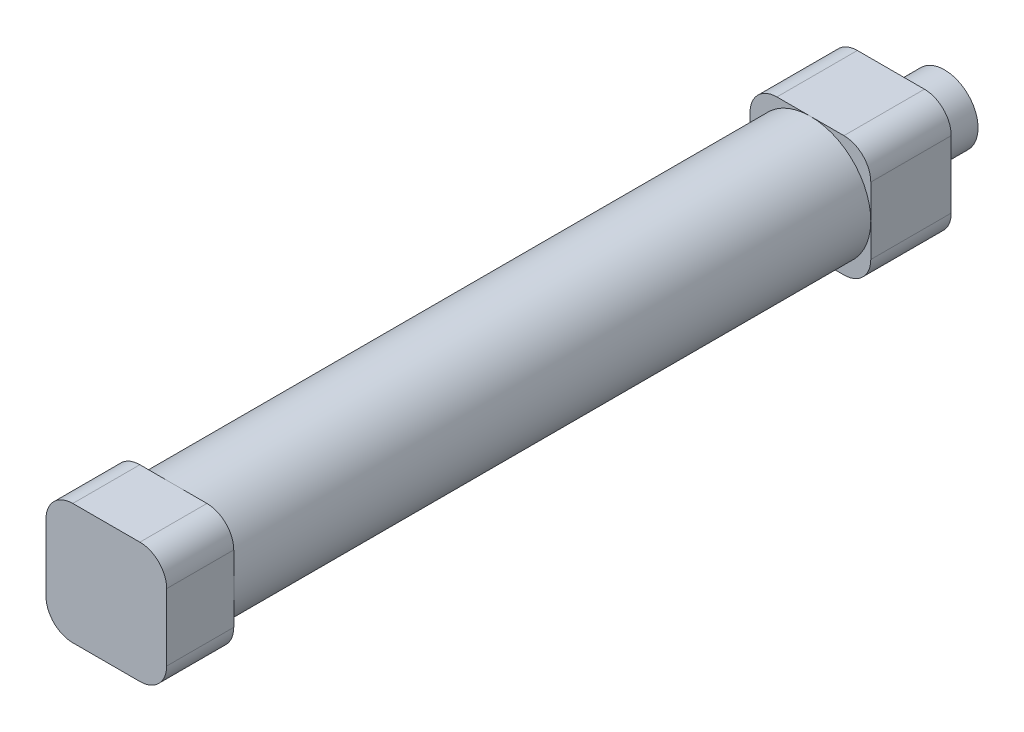
ISO-10303-21;
HEADER;
FILE_DESCRIPTION(('STEP AP214'),'2;1');
FILE_NAME('part.step','',(''),(''),'','','');
FILE_SCHEMA(('AUTOMOTIVE_DESIGN { 1 0 10303 214 1 1 1 1 }'));
ENDSEC;
DATA;
#1=APPLICATION_CONTEXT('core data for automotive mechanical design processes');
#2=APPLICATION_PROTOCOL_DEFINITION('international standard','automotive_design',2000,#1);
#3=PRODUCT_CONTEXT('',#1,'mechanical');
#4=PRODUCT('Part','Part','',(#3));
#5=PRODUCT_RELATED_PRODUCT_CATEGORY('part','',(#4));
#6=PRODUCT_DEFINITION_FORMATION('','',#4);
#7=PRODUCT_DEFINITION_CONTEXT('part definition',#1,'design');
#8=PRODUCT_DEFINITION('design','',#6,#7);
#9=PRODUCT_DEFINITION_SHAPE('','',#8);
#10=(LENGTH_UNIT() NAMED_UNIT(*) SI_UNIT(.MILLI.,.METRE.));
#11=(NAMED_UNIT(*) PLANE_ANGLE_UNIT() SI_UNIT($,.RADIAN.));
#12=(NAMED_UNIT(*) SI_UNIT($,.STERADIAN.) SOLID_ANGLE_UNIT());
#13=UNCERTAINTY_MEASURE_WITH_UNIT(LENGTH_MEASURE(1.E-05),#10,'distance_accuracy_value','');
#14=(GEOMETRIC_REPRESENTATION_CONTEXT(3) GLOBAL_UNCERTAINTY_ASSIGNED_CONTEXT((#13)) GLOBAL_UNIT_ASSIGNED_CONTEXT((#10,
#11,#12)) REPRESENTATION_CONTEXT('',''));
#15=CARTESIAN_POINT('',(0.,0.,0.));
#16=DIRECTION('',(0.,0.,1.));
#17=DIRECTION('',(1.,0.,0.));
#18=AXIS2_PLACEMENT_3D('',#15,#16,#17);
#19=CARTESIAN_POINT('',(4.99999999999999,-5.,0.));
#20=DIRECTION('',(0.,0.,-1.));
#21=DIRECTION('',(-1.,0.,0.));
#22=AXIS2_PLACEMENT_3D('',#19,#20,#21);
#23=PLANE('',#22);
#24=CARTESIAN_POINT('',(0.,0.,0.));
#25=DIRECTION('',(0.,0.,-1.));
#26=DIRECTION('',(-1.,0.,0.));
#27=AXIS2_PLACEMENT_3D('',#24,#25,#26);
#28=CIRCLE('',#27,2.5);
#29=CARTESIAN_POINT('',(-2.5,0.,0.));
#30=VERTEX_POINT('',#29);
#31=EDGE_CURVE('E40',#30,#30,#28,.T.);
#32=ORIENTED_EDGE('',*,*,#31,.T.);
#33=EDGE_LOOP('',(#32));
#34=FACE_BOUND('',#33,.T.);
#35=CARTESIAN_POINT('',(0.,0.,0.));
#36=DIRECTION('',(0.,0.,1.));
#37=DIRECTION('',(1.,0.,0.));
#38=AXIS2_PLACEMENT_3D('',#35,#36,#37);
#39=CIRCLE('',#38,8.);
#40=CARTESIAN_POINT('',(8.,0.,0.));
#41=VERTEX_POINT('',#40);
#42=EDGE_CURVE('E276',#41,#41,#39,.T.);
#43=ORIENTED_EDGE('',*,*,#42,.T.);
#44=EDGE_LOOP('',(#43));
#45=FACE_BOUND('',#44,.T.);
#46=ADVANCED_FACE('F36',(#34,#45),#23,.F.);
#47=CARTESIAN_POINT('',(-5.,5.,95.));
#48=DIRECTION('',(0.,0.,1.));
#49=DIRECTION('',(1.,0.,0.));
#50=AXIS2_PLACEMENT_3D('',#47,#48,#49);
#51=PLANE('',#50);
#52=CARTESIAN_POINT('',(0.,0.,95.));
#53=DIRECTION('',(0.,0.,1.));
#54=DIRECTION('',(1.,0.,0.));
#55=AXIS2_PLACEMENT_3D('',#52,#53,#54);
#56=CIRCLE('',#55,8.);
#57=CARTESIAN_POINT('',(8.,0.,95.));
#58=VERTEX_POINT('',#57);
#59=EDGE_CURVE('E273',#58,#58,#56,.T.);
#60=ORIENTED_EDGE('',*,*,#59,.F.);
#61=EDGE_LOOP('',(#60));
#62=FACE_BOUND('',#61,.T.);
#63=ADVANCED_FACE('F366',(#62),#51,.F.);
#64=CARTESIAN_POINT('',(0.,0.,95.));
#65=DIRECTION('',(0.,0.,-1.));
#66=DIRECTION('',(-1.,0.,0.));
#67=AXIS2_PLACEMENT_3D('',#64,#65,#66);
#68=CYLINDRICAL_SURFACE('',#67,8.);
#69=ORIENTED_EDGE('',*,*,#59,.T.);
#70=EDGE_LOOP('',(#69));
#71=FACE_BOUND('',#70,.T.);
#72=ORIENTED_EDGE('',*,*,#42,.F.);
#73=EDGE_LOOP('',(#72));
#74=FACE_BOUND('',#73,.T.);
#75=ADVANCED_FACE('F373',(#71,#74),#68,.F.);
#76=CARTESIAN_POINT('',(0.,0.,18.));
#77=DIRECTION('',(0.,0.,-1.));
#78=DIRECTION('',(-1.,0.,0.));
#79=AXIS2_PLACEMENT_3D('',#76,#77,#78);
#80=CYLINDRICAL_SURFACE('',#79,2.5);
#81=CARTESIAN_POINT('',(0.,0.,-20.));
#82=DIRECTION('',(0.,0.,-1.));
#83=DIRECTION('',(-1.,0.,0.));
#84=AXIS2_PLACEMENT_3D('',#81,#82,#83);
#85=CIRCLE('',#84,2.5);
#86=CARTESIAN_POINT('',(-2.5,0.,-20.));
#87=VERTEX_POINT('',#86);
#88=EDGE_CURVE('E564',#87,#87,#85,.T.);
#89=ORIENTED_EDGE('',*,*,#88,.T.);
#90=EDGE_LOOP('',(#89));
#91=FACE_BOUND('',#90,.T.);
#92=ORIENTED_EDGE('',*,*,#31,.F.);
#93=EDGE_LOOP('',(#92));
#94=FACE_BOUND('',#93,.T.);
#95=ADVANCED_FACE('F455',(#91,#94),#80,.F.);
#96=CARTESIAN_POINT('',(4.99999999999999,-5.,-12.));
#97=DIRECTION('',(0.,0.,-1.));
#98=DIRECTION('',(-1.,0.,0.));
#99=AXIS2_PLACEMENT_3D('',#96,#97,#98);
#100=PLANE('',#99);
#101=CARTESIAN_POINT('',(4.99999999999999,-5.,-12.));
#102=DIRECTION('',(0.,0.,-1.));
#103=DIRECTION('',(-1.,0.,0.));
#104=AXIS2_PLACEMENT_3D('',#101,#102,#103);
#105=CIRCLE('',#104,4.);
#106=CARTESIAN_POINT('',(8.99999999999999,-5.,-12.));
#107=VERTEX_POINT('',#106);
#108=CARTESIAN_POINT('',(4.99999999999999,-9.,-12.));
#109=VERTEX_POINT('',#108);
#110=EDGE_CURVE('E188',#107,#109,#105,.T.);
#111=ORIENTED_EDGE('',*,*,#110,.T.);
#112=DIRECTION('',(-1.,0.,0.));
#113=VECTOR('',#112,1.);
#114=CARTESIAN_POINT('',(4.99999999999999,-9.,-12.));
#115=LINE('',#114,#113);
#116=CARTESIAN_POINT('',(-5.00000000000001,-9.,-12.));
#117=VERTEX_POINT('',#116);
#118=EDGE_CURVE('E176',#109,#117,#115,.T.);
#119=ORIENTED_EDGE('',*,*,#118,.T.);
#120=CARTESIAN_POINT('',(-5.00000000000001,-5.,-12.));
#121=DIRECTION('',(0.,0.,-1.));
#122=DIRECTION('',(-1.,0.,0.));
#123=AXIS2_PLACEMENT_3D('',#120,#121,#122);
#124=CIRCLE('',#123,4.);
#125=CARTESIAN_POINT('',(-9.00000000000001,-5.,-12.));
#126=VERTEX_POINT('',#125);
#127=EDGE_CURVE('E187',#117,#126,#124,.T.);
#128=ORIENTED_EDGE('',*,*,#127,.T.);
#129=DIRECTION('',(0.,1.,0.));
#130=VECTOR('',#129,1.);
#131=CARTESIAN_POINT('',(-9.00000000000001,-5.,-12.));
#132=LINE('',#131,#130);
#133=CARTESIAN_POINT('',(-9.00000000000001,5.,-12.));
#134=VERTEX_POINT('',#133);
#135=EDGE_CURVE('E342',#126,#134,#132,.T.);
#136=ORIENTED_EDGE('',*,*,#135,.T.);
#137=CARTESIAN_POINT('',(-5.00000000000001,5.,-12.));
#138=DIRECTION('',(0.,0.,-1.));
#139=DIRECTION('',(-1.,0.,0.));
#140=AXIS2_PLACEMENT_3D('',#137,#138,#139);
#141=CIRCLE('',#140,4.);
#142=CARTESIAN_POINT('',(-5.00000000000001,9.,-12.));
#143=VERTEX_POINT('',#142);
#144=EDGE_CURVE('E341',#134,#143,#141,.T.);
#145=ORIENTED_EDGE('',*,*,#144,.T.);
#146=DIRECTION('',(1.,0.,0.));
#147=VECTOR('',#146,1.);
#148=CARTESIAN_POINT('',(4.99999999999999,9.,-12.));
#149=LINE('',#148,#147);
#150=CARTESIAN_POINT('',(4.99999999999999,9.,-12.));
#151=VERTEX_POINT('',#150);
#152=EDGE_CURVE('E344',#143,#151,#149,.T.);
#153=ORIENTED_EDGE('',*,*,#152,.T.);
#154=CARTESIAN_POINT('',(4.99999999999999,5.,-12.));
#155=DIRECTION('',(0.,0.,-1.));
#156=DIRECTION('',(-1.,0.,0.));
#157=AXIS2_PLACEMENT_3D('',#154,#155,#156);
#158=CIRCLE('',#157,4.);
#159=CARTESIAN_POINT('',(8.99999999999999,5.,-12.));
#160=VERTEX_POINT('',#159);
#161=EDGE_CURVE('E349',#151,#160,#158,.T.);
#162=ORIENTED_EDGE('',*,*,#161,.T.);
#163=DIRECTION('',(0.,-1.,0.));
#164=VECTOR('',#163,1.);
#165=CARTESIAN_POINT('',(8.99999999999999,-5.,-12.));
#166=LINE('',#165,#164);
#167=EDGE_CURVE('E194',#160,#107,#166,.T.);
#168=ORIENTED_EDGE('',*,*,#167,.T.);
#169=EDGE_LOOP('',(#111,#119,#128,#136,#145,#153,#162,#168));
#170=FACE_BOUND('',#169,.T.);
#171=CARTESIAN_POINT('',(0.,0.,-12.));
#172=DIRECTION('',(0.,0.,-1.));
#173=DIRECTION('',(-1.,0.,0.));
#174=AXIS2_PLACEMENT_3D('',#171,#172,#173);
#175=CIRCLE('',#174,5.);
#176=CARTESIAN_POINT('',(-5.,0.,-12.));
#177=VERTEX_POINT('',#176);
#178=EDGE_CURVE('E570',#177,#177,#175,.T.);
#179=ORIENTED_EDGE('',*,*,#178,.F.);
#180=EDGE_LOOP('',(#179));
#181=FACE_BOUND('',#180,.T.);
#182=ADVANCED_FACE('F191',(#170,#181),#100,.T.);
#183=CARTESIAN_POINT('',(0.,0.,95.));
#184=DIRECTION('',(0.,0.,-1.));
#185=DIRECTION('',(-1.,0.,0.));
#186=AXIS2_PLACEMENT_3D('',#183,#184,#185);
#187=CYLINDRICAL_SURFACE('',#186,9.);
#188=CARTESIAN_POINT('',(0.,0.,95.));
#189=DIRECTION('',(0.,0.,1.));
#190=DIRECTION('',(1.,0.,0.));
#191=AXIS2_PLACEMENT_3D('',#188,#189,#190);
#192=CIRCLE('',#191,9.);
#193=CARTESIAN_POINT('',(9.,0.,95.));
#194=VERTEX_POINT('',#193);
#195=CARTESIAN_POINT('',(0.,9.,95.));
#196=VERTEX_POINT('',#195);
#197=EDGE_CURVE('E12',#194,#196,#192,.T.);
#198=ORIENTED_EDGE('',*,*,#197,.F.);
#199=CARTESIAN_POINT('',(0.,-9.,95.));
#200=VERTEX_POINT('',#199);
#201=EDGE_CURVE('E47',#200,#194,#192,.T.);
#202=ORIENTED_EDGE('',*,*,#201,.F.);
#203=CARTESIAN_POINT('',(-9.,0.,95.));
#204=VERTEX_POINT('',#203);
#205=EDGE_CURVE('E286',#204,#200,#192,.T.);
#206=ORIENTED_EDGE('',*,*,#205,.F.);
#207=EDGE_CURVE('E45',#196,#204,#192,.T.);
#208=ORIENTED_EDGE('',*,*,#207,.F.);
#209=EDGE_LOOP('',(#198,#202,#206,#208));
#210=FACE_BOUND('',#209,.T.);
#211=CARTESIAN_POINT('',(0.,0.,0.));
#212=DIRECTION('',(0.,0.,1.));
#213=DIRECTION('',(1.,0.,0.));
#214=AXIS2_PLACEMENT_3D('',#211,#212,#213);
#215=CIRCLE('',#214,9.);
#216=CARTESIAN_POINT('',(8.99999999999999,0.,0.));
#217=VERTEX_POINT('',#216);
#218=CARTESIAN_POINT('',(0.,9.,0.));
#219=VERTEX_POINT('',#218);
#220=EDGE_CURVE('E279',#217,#219,#215,.T.);
#221=ORIENTED_EDGE('',*,*,#220,.T.);
#222=CARTESIAN_POINT('',(-9.00000000000001,0.,0.));
#223=VERTEX_POINT('',#222);
#224=EDGE_CURVE('E281',#219,#223,#215,.T.);
#225=ORIENTED_EDGE('',*,*,#224,.T.);
#226=CARTESIAN_POINT('',(0.,-9.,0.));
#227=VERTEX_POINT('',#226);
#228=EDGE_CURVE('E287',#223,#227,#215,.T.);
#229=ORIENTED_EDGE('',*,*,#228,.T.);
#230=EDGE_CURVE('E278',#227,#217,#215,.T.);
#231=ORIENTED_EDGE('',*,*,#230,.T.);
#232=EDGE_LOOP('',(#221,#225,#229,#231));
#233=FACE_BOUND('',#232,.T.);
#234=ADVANCED_FACE('F38',(#210,#233),#187,.T.);
#235=DIRECTION('',(0.,1.,0.));
#236=VECTOR('',#235,1.);
#237=CARTESIAN_POINT('',(9.,-5.,95.));
#238=LINE('',#237,#236);
#239=CARTESIAN_POINT('',(9.,5.,95.));
#240=VERTEX_POINT('',#239);
#241=EDGE_CURVE('E241',#194,#240,#238,.T.);
#242=ORIENTED_EDGE('',*,*,#241,.F.);
#243=ORIENTED_EDGE('',*,*,#197,.T.);
#244=DIRECTION('',(-1.,0.,0.));
#245=VECTOR('',#244,1.);
#246=CARTESIAN_POINT('',(-5.,9.,95.));
#247=LINE('',#246,#245);
#248=CARTESIAN_POINT('',(5.,9.,95.));
#249=VERTEX_POINT('',#248);
#250=EDGE_CURVE('E215',#249,#196,#247,.T.);
#251=ORIENTED_EDGE('',*,*,#250,.F.);
#252=CARTESIAN_POINT('',(5.,5.,95.));
#253=DIRECTION('',(0.,0.,1.));
#254=DIRECTION('',(1.,0.,0.));
#255=AXIS2_PLACEMENT_3D('',#252,#253,#254);
#256=CIRCLE('',#255,4.);
#257=EDGE_CURVE('E245',#240,#249,#256,.T.);
#258=ORIENTED_EDGE('',*,*,#257,.F.);
#259=EDGE_LOOP('',(#242,#243,#251,#258));
#260=FACE_BOUND('',#259,.T.);
#261=ADVANCED_FACE('F376',(#260),#51,.F.);
#262=CARTESIAN_POINT('',(-5.,9.,95.));
#263=VERTEX_POINT('',#262);
#264=EDGE_CURVE('E247',#196,#263,#247,.T.);
#265=ORIENTED_EDGE('',*,*,#264,.F.);
#266=ORIENTED_EDGE('',*,*,#207,.T.);
#267=DIRECTION('',(0.,-1.,0.));
#268=VECTOR('',#267,1.);
#269=CARTESIAN_POINT('',(-9.,-5.,95.));
#270=LINE('',#269,#268);
#271=CARTESIAN_POINT('',(-9.,5.,95.));
#272=VERTEX_POINT('',#271);
#273=EDGE_CURVE('E230',#272,#204,#270,.T.);
#274=ORIENTED_EDGE('',*,*,#273,.F.);
#275=CARTESIAN_POINT('',(-5.,5.,95.));
#276=DIRECTION('',(0.,0.,1.));
#277=DIRECTION('',(1.,0.,0.));
#278=AXIS2_PLACEMENT_3D('',#275,#276,#277);
#279=CIRCLE('',#278,4.);
#280=EDGE_CURVE('E202',#263,#272,#279,.T.);
#281=ORIENTED_EDGE('',*,*,#280,.F.);
#282=EDGE_LOOP('',(#265,#266,#274,#281));
#283=FACE_BOUND('',#282,.T.);
#284=ADVANCED_FACE('F592',(#283),#51,.F.);
#285=CARTESIAN_POINT('',(-9.,-5.,95.));
#286=VERTEX_POINT('',#285);
#287=EDGE_CURVE('E205',#204,#286,#270,.T.);
#288=ORIENTED_EDGE('',*,*,#287,.F.);
#289=ORIENTED_EDGE('',*,*,#205,.T.);
#290=DIRECTION('',(1.,0.,0.));
#291=VECTOR('',#290,1.);
#292=CARTESIAN_POINT('',(-5.,-9.,95.));
#293=LINE('',#292,#291);
#294=CARTESIAN_POINT('',(-5.,-9.,95.));
#295=VERTEX_POINT('',#294);
#296=EDGE_CURVE('E236',#295,#200,#293,.T.);
#297=ORIENTED_EDGE('',*,*,#296,.F.);
#298=CARTESIAN_POINT('',(-5.,-5.,95.));
#299=DIRECTION('',(0.,0.,1.));
#300=DIRECTION('',(1.,0.,0.));
#301=AXIS2_PLACEMENT_3D('',#298,#299,#300);
#302=CIRCLE('',#301,4.);
#303=EDGE_CURVE('E233',#286,#295,#302,.T.);
#304=ORIENTED_EDGE('',*,*,#303,.F.);
#305=EDGE_LOOP('',(#288,#289,#297,#304));
#306=FACE_BOUND('',#305,.T.);
#307=ADVANCED_FACE('F595',(#306),#51,.F.);
#308=CARTESIAN_POINT('',(5.,-9.,95.));
#309=VERTEX_POINT('',#308);
#310=EDGE_CURVE('E235',#200,#309,#293,.T.);
#311=ORIENTED_EDGE('',*,*,#310,.F.);
#312=ORIENTED_EDGE('',*,*,#201,.T.);
#313=CARTESIAN_POINT('',(9.,-5.,95.));
#314=VERTEX_POINT('',#313);
#315=EDGE_CURVE('E242',#314,#194,#238,.T.);
#316=ORIENTED_EDGE('',*,*,#315,.F.);
#317=CARTESIAN_POINT('',(5.,-5.,95.));
#318=DIRECTION('',(0.,0.,1.));
#319=DIRECTION('',(-1.,0.,0.));
#320=AXIS2_PLACEMENT_3D('',#317,#318,#319);
#321=CIRCLE('',#320,4.);
#322=EDGE_CURVE('E239',#309,#314,#321,.T.);
#323=ORIENTED_EDGE('',*,*,#322,.F.);
#324=EDGE_LOOP('',(#311,#312,#316,#323));
#325=FACE_BOUND('',#324,.T.);
#326=ADVANCED_FACE('F377',(#325),#51,.F.);
#327=CARTESIAN_POINT('',(-5.,5.,105.));
#328=DIRECTION('',(0.,0.,-1.));
#329=DIRECTION('',(-1.,0.,0.));
#330=AXIS2_PLACEMENT_3D('',#327,#328,#329);
#331=CYLINDRICAL_SURFACE('',#330,4.);
#332=ORIENTED_EDGE('',*,*,#280,.T.);
#333=DIRECTION('',(0.,0.,-1.));
#334=VECTOR('',#333,1.);
#335=CARTESIAN_POINT('',(-9.,5.,105.));
#336=LINE('',#335,#334);
#337=CARTESIAN_POINT('',(-9.,5.,105.));
#338=VERTEX_POINT('',#337);
#339=EDGE_CURVE('E270',#338,#272,#336,.T.);
#340=ORIENTED_EDGE('',*,*,#339,.F.);
#341=CARTESIAN_POINT('',(-5.,5.,105.));
#342=DIRECTION('',(0.,0.,1.));
#343=DIRECTION('',(1.,0.,0.));
#344=AXIS2_PLACEMENT_3D('',#341,#342,#343);
#345=CIRCLE('',#344,4.);
#346=CARTESIAN_POINT('',(-5.,9.,105.));
#347=VERTEX_POINT('',#346);
#348=EDGE_CURVE('E211',#347,#338,#345,.T.);
#349=ORIENTED_EDGE('',*,*,#348,.F.);
#350=DIRECTION('',(0.,0.,-1.));
#351=VECTOR('',#350,1.);
#352=CARTESIAN_POINT('',(-5.,9.,105.));
#353=LINE('',#352,#351);
#354=EDGE_CURVE('E228',#347,#263,#353,.T.);
#355=ORIENTED_EDGE('',*,*,#354,.T.);
#356=EDGE_LOOP('',(#332,#340,#349,#355));
#357=FACE_BOUND('',#356,.T.);
#358=ADVANCED_FACE('F499',(#357),#331,.T.);
#359=CARTESIAN_POINT('',(-9.,-5.,105.));
#360=DIRECTION('',(1.,0.,0.));
#361=DIRECTION('',(0.,0.,-1.));
#362=AXIS2_PLACEMENT_3D('',#359,#360,#361);
#363=PLANE('',#362);
#364=CARTESIAN_POINT('',(-9.00000000000001,0.,99.));
#365=DIRECTION('',(-1.,0.,0.));
#366=DIRECTION('',(0.,0.,1.));
#367=AXIS2_PLACEMENT_3D('',#364,#365,#366);
#368=CIRCLE('',#367,1.98051649837292);
#369=CARTESIAN_POINT('',(-9.00000000000001,0.,100.980516498373));
#370=VERTEX_POINT('',#369);
#371=EDGE_CURVE('E555',#370,#370,#368,.T.);
#372=ORIENTED_EDGE('',*,*,#371,.F.);
#373=EDGE_LOOP('',(#372));
#374=FACE_BOUND('',#373,.T.);
#375=ORIENTED_EDGE('',*,*,#273,.T.);
#376=ORIENTED_EDGE('',*,*,#287,.T.);
#377=DIRECTION('',(0.,0.,-1.));
#378=VECTOR('',#377,1.);
#379=CARTESIAN_POINT('',(-9.,-5.,105.));
#380=LINE('',#379,#378);
#381=CARTESIAN_POINT('',(-9.,-5.,105.));
#382=VERTEX_POINT('',#381);
#383=EDGE_CURVE('E267',#382,#286,#380,.T.);
#384=ORIENTED_EDGE('',*,*,#383,.F.);
#385=DIRECTION('',(0.,-1.,0.));
#386=VECTOR('',#385,1.);
#387=CARTESIAN_POINT('',(-9.,-5.,105.));
#388=LINE('',#387,#386);
#389=EDGE_CURVE('E214',#338,#382,#388,.T.);
#390=ORIENTED_EDGE('',*,*,#389,.F.);
#391=ORIENTED_EDGE('',*,*,#339,.T.);
#392=EDGE_LOOP('',(#375,#376,#384,#390,#391));
#393=FACE_BOUND('',#392,.T.);
#394=ADVANCED_FACE('F494',(#374,#393),#363,.F.);
#395=CARTESIAN_POINT('',(-5.,-5.,105.));
#396=DIRECTION('',(0.,0.,-1.));
#397=DIRECTION('',(-1.,0.,0.));
#398=AXIS2_PLACEMENT_3D('',#395,#396,#397);
#399=CYLINDRICAL_SURFACE('',#398,4.);
#400=ORIENTED_EDGE('',*,*,#303,.T.);
#401=DIRECTION('',(0.,0.,-1.));
#402=VECTOR('',#401,1.);
#403=CARTESIAN_POINT('',(-5.,-9.,105.));
#404=LINE('',#403,#402);
#405=CARTESIAN_POINT('',(-5.,-9.,105.));
#406=VERTEX_POINT('',#405);
#407=EDGE_CURVE('E264',#406,#295,#404,.T.);
#408=ORIENTED_EDGE('',*,*,#407,.F.);
#409=CARTESIAN_POINT('',(-5.,-5.,105.));
#410=DIRECTION('',(0.,0.,1.));
#411=DIRECTION('',(1.,0.,0.));
#412=AXIS2_PLACEMENT_3D('',#409,#410,#411);
#413=CIRCLE('',#412,4.);
#414=EDGE_CURVE('E217',#382,#406,#413,.T.);
#415=ORIENTED_EDGE('',*,*,#414,.F.);
#416=ORIENTED_EDGE('',*,*,#383,.T.);
#417=EDGE_LOOP('',(#400,#408,#415,#416));
#418=FACE_BOUND('',#417,.T.);
#419=ADVANCED_FACE('F498',(#418),#399,.T.);
#420=CARTESIAN_POINT('',(-5.,-9.,105.));
#421=DIRECTION('',(0.,1.,0.));
#422=DIRECTION('',(0.,0.,1.));
#423=AXIS2_PLACEMENT_3D('',#420,#421,#422);
#424=PLANE('',#423);
#425=ORIENTED_EDGE('',*,*,#296,.T.);
#426=ORIENTED_EDGE('',*,*,#310,.T.);
#427=DIRECTION('',(0.,0.,-1.));
#428=VECTOR('',#427,1.);
#429=CARTESIAN_POINT('',(5.,-9.,105.));
#430=LINE('',#429,#428);
#431=CARTESIAN_POINT('',(5.,-9.,105.));
#432=VERTEX_POINT('',#431);
#433=EDGE_CURVE('E261',#432,#309,#430,.T.);
#434=ORIENTED_EDGE('',*,*,#433,.F.);
#435=DIRECTION('',(1.,0.,0.));
#436=VECTOR('',#435,1.);
#437=CARTESIAN_POINT('',(-5.,-9.,105.));
#438=LINE('',#437,#436);
#439=EDGE_CURVE('E219',#406,#432,#438,.T.);
#440=ORIENTED_EDGE('',*,*,#439,.F.);
#441=ORIENTED_EDGE('',*,*,#407,.T.);
#442=EDGE_LOOP('',(#425,#426,#434,#440,#441));
#443=FACE_BOUND('',#442,.T.);
#444=ADVANCED_FACE('F603',(#443),#424,.F.);
#445=CARTESIAN_POINT('',(5.,-5.,105.));
#446=DIRECTION('',(0.,0.,-1.));
#447=DIRECTION('',(-1.,0.,0.));
#448=AXIS2_PLACEMENT_3D('',#445,#446,#447);
#449=CYLINDRICAL_SURFACE('',#448,4.);
#450=ORIENTED_EDGE('',*,*,#322,.T.);
#451=DIRECTION('',(0.,0.,-1.));
#452=VECTOR('',#451,1.);
#453=CARTESIAN_POINT('',(9.,-5.,105.));
#454=LINE('',#453,#452);
#455=CARTESIAN_POINT('',(9.,-5.,105.));
#456=VERTEX_POINT('',#455);
#457=EDGE_CURVE('E258',#456,#314,#454,.T.);
#458=ORIENTED_EDGE('',*,*,#457,.F.);
#459=CARTESIAN_POINT('',(5.,-5.,105.));
#460=DIRECTION('',(0.,0.,1.));
#461=DIRECTION('',(-1.,0.,0.));
#462=AXIS2_PLACEMENT_3D('',#459,#460,#461);
#463=CIRCLE('',#462,4.);
#464=EDGE_CURVE('E221',#432,#456,#463,.T.);
#465=ORIENTED_EDGE('',*,*,#464,.F.);
#466=ORIENTED_EDGE('',*,*,#433,.T.);
#467=EDGE_LOOP('',(#450,#458,#465,#466));
#468=FACE_BOUND('',#467,.T.);
#469=ADVANCED_FACE('F621',(#468),#449,.T.);
#470=CARTESIAN_POINT('',(9.,-5.,105.));
#471=DIRECTION('',(-1.,0.,0.));
#472=DIRECTION('',(0.,-1.,0.));
#473=AXIS2_PLACEMENT_3D('',#470,#471,#472);
#474=PLANE('',#473);
#475=ORIENTED_EDGE('',*,*,#315,.T.);
#476=ORIENTED_EDGE('',*,*,#241,.T.);
#477=DIRECTION('',(0.,0.,-1.));
#478=VECTOR('',#477,1.);
#479=CARTESIAN_POINT('',(9.,5.,105.));
#480=LINE('',#479,#478);
#481=CARTESIAN_POINT('',(9.,5.,105.));
#482=VERTEX_POINT('',#481);
#483=EDGE_CURVE('E255',#482,#240,#480,.T.);
#484=ORIENTED_EDGE('',*,*,#483,.F.);
#485=DIRECTION('',(0.,1.,0.));
#486=VECTOR('',#485,1.);
#487=CARTESIAN_POINT('',(9.,-5.,105.));
#488=LINE('',#487,#486);
#489=EDGE_CURVE('E223',#456,#482,#488,.T.);
#490=ORIENTED_EDGE('',*,*,#489,.F.);
#491=ORIENTED_EDGE('',*,*,#457,.T.);
#492=EDGE_LOOP('',(#475,#476,#484,#490,#491));
#493=FACE_BOUND('',#492,.T.);
#494=ADVANCED_FACE('F625',(#493),#474,.F.);
#495=CARTESIAN_POINT('',(5.,5.,105.));
#496=DIRECTION('',(0.,0.,-1.));
#497=DIRECTION('',(-1.,0.,0.));
#498=AXIS2_PLACEMENT_3D('',#495,#496,#497);
#499=CYLINDRICAL_SURFACE('',#498,4.);
#500=ORIENTED_EDGE('',*,*,#257,.T.);
#501=DIRECTION('',(0.,0.,-1.));
#502=VECTOR('',#501,1.);
#503=CARTESIAN_POINT('',(5.,9.,105.));
#504=LINE('',#503,#502);
#505=CARTESIAN_POINT('',(5.,9.,105.));
#506=VERTEX_POINT('',#505);
#507=EDGE_CURVE('E252',#506,#249,#504,.T.);
#508=ORIENTED_EDGE('',*,*,#507,.F.);
#509=CARTESIAN_POINT('',(5.,5.,105.));
#510=DIRECTION('',(0.,0.,1.));
#511=DIRECTION('',(1.,0.,0.));
#512=AXIS2_PLACEMENT_3D('',#509,#510,#511);
#513=CIRCLE('',#512,4.);
#514=EDGE_CURVE('E225',#482,#506,#513,.T.);
#515=ORIENTED_EDGE('',*,*,#514,.F.);
#516=ORIENTED_EDGE('',*,*,#483,.T.);
#517=EDGE_LOOP('',(#500,#508,#515,#516));
#518=FACE_BOUND('',#517,.T.);
#519=ADVANCED_FACE('F628',(#518),#499,.T.);
#520=CARTESIAN_POINT('',(-5.,9.,105.));
#521=DIRECTION('',(0.,-1.,0.));
#522=DIRECTION('',(0.,0.,-1.));
#523=AXIS2_PLACEMENT_3D('',#520,#521,#522);
#524=PLANE('',#523);
#525=ORIENTED_EDGE('',*,*,#250,.T.);
#526=ORIENTED_EDGE('',*,*,#264,.T.);
#527=ORIENTED_EDGE('',*,*,#354,.F.);
#528=DIRECTION('',(-1.,0.,0.));
#529=VECTOR('',#528,1.);
#530=CARTESIAN_POINT('',(-5.,9.,105.));
#531=LINE('',#530,#529);
#532=EDGE_CURVE('E227',#506,#347,#531,.T.);
#533=ORIENTED_EDGE('',*,*,#532,.F.);
#534=ORIENTED_EDGE('',*,*,#507,.T.);
#535=EDGE_LOOP('',(#525,#526,#527,#533,#534));
#536=FACE_BOUND('',#535,.T.);
#537=ADVANCED_FACE('F401',(#536),#524,.F.);
#538=CARTESIAN_POINT('',(-5.,5.,105.));
#539=DIRECTION('',(0.,0.,1.));
#540=DIRECTION('',(1.,0.,0.));
#541=AXIS2_PLACEMENT_3D('',#538,#539,#540);
#542=PLANE('',#541);
#543=ORIENTED_EDGE('',*,*,#348,.T.);
#544=ORIENTED_EDGE('',*,*,#389,.T.);
#545=ORIENTED_EDGE('',*,*,#414,.T.);
#546=ORIENTED_EDGE('',*,*,#439,.T.);
#547=ORIENTED_EDGE('',*,*,#464,.T.);
#548=ORIENTED_EDGE('',*,*,#489,.T.);
#549=ORIENTED_EDGE('',*,*,#514,.T.);
#550=ORIENTED_EDGE('',*,*,#532,.T.);
#551=EDGE_LOOP('',(#543,#544,#545,#546,#547,#548,#549,#550));
#552=FACE_BOUND('',#551,.T.);
#553=ADVANCED_FACE('F396',(#552),#542,.T.);
#554=ORIENTED_EDGE('',*,*,#220,.F.);
#555=DIRECTION('',(0.,-1.,0.));
#556=VECTOR('',#555,1.);
#557=CARTESIAN_POINT('',(8.99999999999999,-5.,0.));
#558=LINE('',#557,#556);
#559=CARTESIAN_POINT('',(8.99999999999999,5.,0.));
#560=VERTEX_POINT('',#559);
#561=EDGE_CURVE('E54',#560,#217,#558,.T.);
#562=ORIENTED_EDGE('',*,*,#561,.F.);
#563=CARTESIAN_POINT('',(4.99999999999999,5.,0.));
#564=DIRECTION('',(0.,0.,-1.));
#565=DIRECTION('',(-1.,0.,0.));
#566=AXIS2_PLACEMENT_3D('',#563,#564,#565);
#567=CIRCLE('',#566,4.);
#568=CARTESIAN_POINT('',(4.99999999999999,9.,0.));
#569=VERTEX_POINT('',#568);
#570=EDGE_CURVE('E322',#569,#560,#567,.T.);
#571=ORIENTED_EDGE('',*,*,#570,.F.);
#572=DIRECTION('',(1.,0.,0.));
#573=VECTOR('',#572,1.);
#574=CARTESIAN_POINT('',(4.99999999999999,9.,0.));
#575=LINE('',#574,#573);
#576=EDGE_CURVE('E314',#219,#569,#575,.T.);
#577=ORIENTED_EDGE('',*,*,#576,.F.);
#578=EDGE_LOOP('',(#554,#562,#571,#577));
#579=FACE_BOUND('',#578,.T.);
#580=ADVANCED_FACE('F386',(#579),#23,.F.);
#581=ORIENTED_EDGE('',*,*,#224,.F.);
#582=CARTESIAN_POINT('',(-5.00000000000001,9.,0.));
#583=VERTEX_POINT('',#582);
#584=EDGE_CURVE('E319',#583,#219,#575,.T.);
#585=ORIENTED_EDGE('',*,*,#584,.F.);
#586=CARTESIAN_POINT('',(-5.00000000000001,5.,0.));
#587=DIRECTION('',(0.,0.,-1.));
#588=DIRECTION('',(-1.,0.,0.));
#589=AXIS2_PLACEMENT_3D('',#586,#587,#588);
#590=CIRCLE('',#589,4.);
#591=CARTESIAN_POINT('',(-9.00000000000001,5.,0.));
#592=VERTEX_POINT('',#591);
#593=EDGE_CURVE('E304',#592,#583,#590,.T.);
#594=ORIENTED_EDGE('',*,*,#593,.F.);
#595=DIRECTION('',(0.,1.,0.));
#596=VECTOR('',#595,1.);
#597=CARTESIAN_POINT('',(-9.00000000000001,-5.,0.));
#598=LINE('',#597,#596);
#599=EDGE_CURVE('E300',#223,#592,#598,.T.);
#600=ORIENTED_EDGE('',*,*,#599,.F.);
#601=EDGE_LOOP('',(#581,#585,#594,#600));
#602=FACE_BOUND('',#601,.T.);
#603=ADVANCED_FACE('F301',(#602),#23,.F.);
#604=ORIENTED_EDGE('',*,*,#228,.F.);
#605=CARTESIAN_POINT('',(-9.00000000000001,-5.,0.));
#606=VERTEX_POINT('',#605);
#607=EDGE_CURVE('E296',#606,#223,#598,.T.);
#608=ORIENTED_EDGE('',*,*,#607,.F.);
#609=CARTESIAN_POINT('',(-5.00000000000001,-5.,0.));
#610=DIRECTION('',(0.,0.,-1.));
#611=DIRECTION('',(-1.,0.,0.));
#612=AXIS2_PLACEMENT_3D('',#609,#610,#611);
#613=CIRCLE('',#612,4.);
#614=CARTESIAN_POINT('',(-5.00000000000001,-9.,0.));
#615=VERTEX_POINT('',#614);
#616=EDGE_CURVE('E308',#615,#606,#613,.T.);
#617=ORIENTED_EDGE('',*,*,#616,.F.);
#618=DIRECTION('',(-1.,0.,0.));
#619=VECTOR('',#618,1.);
#620=CARTESIAN_POINT('',(4.99999999999999,-9.,0.));
#621=LINE('',#620,#619);
#622=EDGE_CURVE('E297',#227,#615,#621,.T.);
#623=ORIENTED_EDGE('',*,*,#622,.F.);
#624=EDGE_LOOP('',(#604,#608,#617,#623));
#625=FACE_BOUND('',#624,.T.);
#626=ADVANCED_FACE('F293',(#625),#23,.F.);
#627=CARTESIAN_POINT('',(4.99999999999999,-5.,-12.));
#628=DIRECTION('',(0.,0.,1.));
#629=DIRECTION('',(1.,0.,0.));
#630=AXIS2_PLACEMENT_3D('',#627,#628,#629);
#631=CYLINDRICAL_SURFACE('',#630,4.);
#632=CARTESIAN_POINT('',(4.99999999999999,-5.,0.));
#633=DIRECTION('',(0.,0.,-1.));
#634=DIRECTION('',(-1.,0.,0.));
#635=AXIS2_PLACEMENT_3D('',#632,#633,#634);
#636=CIRCLE('',#635,4.);
#637=CARTESIAN_POINT('',(8.99999999999999,-5.,0.));
#638=VERTEX_POINT('',#637);
#639=CARTESIAN_POINT('',(4.99999999999999,-9.,0.));
#640=VERTEX_POINT('',#639);
#641=EDGE_CURVE('E201',#638,#640,#636,.T.);
#642=ORIENTED_EDGE('',*,*,#641,.T.);
#643=DIRECTION('',(0.,0.,1.));
#644=VECTOR('',#643,1.);
#645=CARTESIAN_POINT('',(4.99999999999999,-9.,-12.));
#646=LINE('',#645,#644);
#647=EDGE_CURVE('E181',#109,#640,#646,.T.);
#648=ORIENTED_EDGE('',*,*,#647,.F.);
#649=ORIENTED_EDGE('',*,*,#110,.F.);
#650=DIRECTION('',(0.,0.,1.));
#651=VECTOR('',#650,1.);
#652=CARTESIAN_POINT('',(8.99999999999999,-5.,-12.));
#653=LINE('',#652,#651);
#654=EDGE_CURVE('E326',#107,#638,#653,.T.);
#655=ORIENTED_EDGE('',*,*,#654,.T.);
#656=EDGE_LOOP('',(#642,#648,#649,#655));
#657=FACE_BOUND('',#656,.T.);
#658=ADVANCED_FACE('F199',(#657),#631,.T.);
#659=CARTESIAN_POINT('',(4.99999999999999,-9.,-12.));
#660=DIRECTION('',(0.,1.,0.));
#661=DIRECTION('',(0.,0.,1.));
#662=AXIS2_PLACEMENT_3D('',#659,#660,#661);
#663=PLANE('',#662);
#664=EDGE_CURVE('E353',#640,#227,#621,.T.);
#665=ORIENTED_EDGE('',*,*,#664,.T.);
#666=ORIENTED_EDGE('',*,*,#622,.T.);
#667=DIRECTION('',(0.,0.,1.));
#668=VECTOR('',#667,1.);
#669=CARTESIAN_POINT('',(-5.00000000000001,-9.,-12.));
#670=LINE('',#669,#668);
#671=EDGE_CURVE('E184',#117,#615,#670,.T.);
#672=ORIENTED_EDGE('',*,*,#671,.F.);
#673=ORIENTED_EDGE('',*,*,#118,.F.);
#674=ORIENTED_EDGE('',*,*,#647,.T.);
#675=EDGE_LOOP('',(#665,#666,#672,#673,#674));
#676=FACE_BOUND('',#675,.T.);
#677=ADVANCED_FACE('F179',(#676),#663,.F.);
#678=CARTESIAN_POINT('',(-5.00000000000001,-5.,-12.));
#679=DIRECTION('',(0.,0.,1.));
#680=DIRECTION('',(1.,0.,0.));
#681=AXIS2_PLACEMENT_3D('',#678,#679,#680);
#682=CYLINDRICAL_SURFACE('',#681,4.);
#683=ORIENTED_EDGE('',*,*,#616,.T.);
#684=DIRECTION('',(0.,0.,1.));
#685=VECTOR('',#684,1.);
#686=CARTESIAN_POINT('',(-9.00000000000001,-5.,-12.));
#687=LINE('',#686,#685);
#688=EDGE_CURVE('E207',#126,#606,#687,.T.);
#689=ORIENTED_EDGE('',*,*,#688,.F.);
#690=ORIENTED_EDGE('',*,*,#127,.F.);
#691=ORIENTED_EDGE('',*,*,#671,.T.);
#692=EDGE_LOOP('',(#683,#689,#690,#691));
#693=FACE_BOUND('',#692,.T.);
#694=ADVANCED_FACE('F355',(#693),#682,.T.);
#695=CARTESIAN_POINT('',(-9.00000000000001,-5.,-12.));
#696=DIRECTION('',(1.,0.,0.));
#697=DIRECTION('',(0.,0.,-1.));
#698=AXIS2_PLACEMENT_3D('',#695,#696,#697);
#699=PLANE('',#698);
#700=CARTESIAN_POINT('',(-9.00000000000001,0.,-4.));
#701=DIRECTION('',(-1.,0.,0.));
#702=DIRECTION('',(0.,0.,1.));
#703=AXIS2_PLACEMENT_3D('',#700,#701,#702);
#704=CIRCLE('',#703,2.);
#705=CARTESIAN_POINT('',(-9.00000000000001,0.,-2.));
#706=VERTEX_POINT('',#705);
#707=EDGE_CURVE('E554',#706,#706,#704,.T.);
#708=ORIENTED_EDGE('',*,*,#707,.F.);
#709=EDGE_LOOP('',(#708));
#710=FACE_BOUND('',#709,.T.);
#711=ORIENTED_EDGE('',*,*,#607,.T.);
#712=ORIENTED_EDGE('',*,*,#599,.T.);
#713=DIRECTION('',(0.,0.,1.));
#714=VECTOR('',#713,1.);
#715=CARTESIAN_POINT('',(-9.00000000000001,5.,-12.));
#716=LINE('',#715,#714);
#717=EDGE_CURVE('E336',#134,#592,#716,.T.);
#718=ORIENTED_EDGE('',*,*,#717,.F.);
#719=ORIENTED_EDGE('',*,*,#135,.F.);
#720=ORIENTED_EDGE('',*,*,#688,.T.);
#721=EDGE_LOOP('',(#711,#712,#718,#719,#720));
#722=FACE_BOUND('',#721,.T.);
#723=ADVANCED_FACE('F311',(#710,#722),#699,.F.);
#724=CARTESIAN_POINT('',(-5.00000000000001,5.,-12.));
#725=DIRECTION('',(0.,0.,1.));
#726=DIRECTION('',(1.,0.,0.));
#727=AXIS2_PLACEMENT_3D('',#724,#725,#726);
#728=CYLINDRICAL_SURFACE('',#727,4.);
#729=ORIENTED_EDGE('',*,*,#593,.T.);
#730=DIRECTION('',(0.,0.,1.));
#731=VECTOR('',#730,1.);
#732=CARTESIAN_POINT('',(-5.00000000000001,9.,-12.));
#733=LINE('',#732,#731);
#734=EDGE_CURVE('E333',#143,#583,#733,.T.);
#735=ORIENTED_EDGE('',*,*,#734,.F.);
#736=ORIENTED_EDGE('',*,*,#144,.F.);
#737=ORIENTED_EDGE('',*,*,#717,.T.);
#738=EDGE_LOOP('',(#729,#735,#736,#737));
#739=FACE_BOUND('',#738,.T.);
#740=ADVANCED_FACE('F339',(#739),#728,.T.);
#741=CARTESIAN_POINT('',(4.99999999999999,9.,-12.));
#742=DIRECTION('',(0.,-1.,0.));
#743=DIRECTION('',(0.,0.,-1.));
#744=AXIS2_PLACEMENT_3D('',#741,#742,#743);
#745=PLANE('',#744);
#746=ORIENTED_EDGE('',*,*,#584,.T.);
#747=ORIENTED_EDGE('',*,*,#576,.T.);
#748=DIRECTION('',(0.,0.,1.));
#749=VECTOR('',#748,1.);
#750=CARTESIAN_POINT('',(4.99999999999999,9.,-12.));
#751=LINE('',#750,#749);
#752=EDGE_CURVE('E330',#151,#569,#751,.T.);
#753=ORIENTED_EDGE('',*,*,#752,.F.);
#754=ORIENTED_EDGE('',*,*,#152,.F.);
#755=ORIENTED_EDGE('',*,*,#734,.T.);
#756=EDGE_LOOP('',(#746,#747,#753,#754,#755));
#757=FACE_BOUND('',#756,.T.);
#758=ADVANCED_FACE('F407',(#757),#745,.F.);
#759=CARTESIAN_POINT('',(4.99999999999999,5.,-12.));
#760=DIRECTION('',(0.,0.,1.));
#761=DIRECTION('',(1.,0.,0.));
#762=AXIS2_PLACEMENT_3D('',#759,#760,#761);
#763=CYLINDRICAL_SURFACE('',#762,4.);
#764=ORIENTED_EDGE('',*,*,#570,.T.);
#765=DIRECTION('',(0.,0.,1.));
#766=VECTOR('',#765,1.);
#767=CARTESIAN_POINT('',(8.99999999999999,5.,-12.));
#768=LINE('',#767,#766);
#769=EDGE_CURVE('E328',#160,#560,#768,.T.);
#770=ORIENTED_EDGE('',*,*,#769,.F.);
#771=ORIENTED_EDGE('',*,*,#161,.F.);
#772=ORIENTED_EDGE('',*,*,#752,.T.);
#773=EDGE_LOOP('',(#764,#770,#771,#772));
#774=FACE_BOUND('',#773,.T.);
#775=ADVANCED_FACE('F412',(#774),#763,.T.);
#776=CARTESIAN_POINT('',(8.99999999999999,-5.,-12.));
#777=DIRECTION('',(-1.,0.,0.));
#778=DIRECTION('',(0.,0.,1.));
#779=AXIS2_PLACEMENT_3D('',#776,#777,#778);
#780=PLANE('',#779);
#781=ORIENTED_EDGE('',*,*,#561,.T.);
#782=EDGE_CURVE('E324',#217,#638,#558,.T.);
#783=ORIENTED_EDGE('',*,*,#782,.T.);
#784=ORIENTED_EDGE('',*,*,#654,.F.);
#785=ORIENTED_EDGE('',*,*,#167,.F.);
#786=ORIENTED_EDGE('',*,*,#769,.T.);
#787=EDGE_LOOP('',(#781,#783,#784,#785,#786));
#788=FACE_BOUND('',#787,.T.);
#789=ADVANCED_FACE('F384',(#788),#780,.F.);
#790=ORIENTED_EDGE('',*,*,#230,.F.);
#791=ORIENTED_EDGE('',*,*,#664,.F.);
#792=ORIENTED_EDGE('',*,*,#641,.F.);
#793=ORIENTED_EDGE('',*,*,#782,.F.);
#794=EDGE_LOOP('',(#790,#791,#792,#793));
#795=FACE_BOUND('',#794,.T.);
#796=ADVANCED_FACE('F369',(#795),#23,.F.);
#797=CARTESIAN_POINT('',(0.,0.,-20.));
#798=DIRECTION('',(0.,0.,1.));
#799=DIRECTION('',(1.,0.,0.));
#800=AXIS2_PLACEMENT_3D('',#797,#798,#799);
#801=CYLINDRICAL_SURFACE('',#800,5.);
#802=CARTESIAN_POINT('',(0.,0.,-20.));
#803=DIRECTION('',(0.,0.,-1.));
#804=DIRECTION('',(-1.,0.,0.));
#805=AXIS2_PLACEMENT_3D('',#802,#803,#804);
#806=CIRCLE('',#805,5.);
#807=CARTESIAN_POINT('',(-5.,0.,-20.));
#808=VERTEX_POINT('',#807);
#809=EDGE_CURVE('E352',#808,#808,#806,.T.);
#810=ORIENTED_EDGE('',*,*,#809,.F.);
#811=EDGE_LOOP('',(#810));
#812=FACE_BOUND('',#811,.T.);
#813=ORIENTED_EDGE('',*,*,#178,.T.);
#814=EDGE_LOOP('',(#813));
#815=FACE_BOUND('',#814,.T.);
#816=ADVANCED_FACE('F383',(#812,#815),#801,.T.);
#817=CARTESIAN_POINT('',(0.,0.,-20.));
#818=DIRECTION('',(0.,0.,-1.));
#819=DIRECTION('',(-1.,0.,0.));
#820=AXIS2_PLACEMENT_3D('',#817,#818,#819);
#821=PLANE('',#820);
#822=ORIENTED_EDGE('',*,*,#88,.F.);
#823=EDGE_LOOP('',(#822));
#824=FACE_BOUND('',#823,.T.);
#825=ORIENTED_EDGE('',*,*,#809,.T.);
#826=EDGE_LOOP('',(#825));
#827=FACE_BOUND('',#826,.T.);
#828=ADVANCED_FACE('F463',(#824,#827),#821,.T.);
#829=CARTESIAN_POINT('',(-6.00000000000001,0.,-4.));
#830=DIRECTION('',(-1.,0.,0.));
#831=DIRECTION('',(0.,0.,1.));
#832=AXIS2_PLACEMENT_3D('',#829,#830,#831);
#833=CYLINDRICAL_SURFACE('',#832,2.);
#834=CARTESIAN_POINT('',(-6.00000000000001,0.,-4.));
#835=DIRECTION('',(-1.,0.,0.));
#836=DIRECTION('',(0.,0.,1.));
#837=AXIS2_PLACEMENT_3D('',#834,#835,#836);
#838=CIRCLE('',#837,2.);
#839=CARTESIAN_POINT('',(-6.00000000000001,0.,-2.));
#840=VERTEX_POINT('',#839);
#841=EDGE_CURVE('E558',#840,#840,#838,.T.);
#842=ORIENTED_EDGE('',*,*,#841,.F.);
#843=EDGE_LOOP('',(#842));
#844=FACE_BOUND('',#843,.T.);
#845=ORIENTED_EDGE('',*,*,#707,.T.);
#846=EDGE_LOOP('',(#845));
#847=FACE_BOUND('',#846,.T.);
#848=ADVANCED_FACE('F487',(#844,#847),#833,.F.);
#849=CARTESIAN_POINT('',(-6.00000000000001,0.,-4.));
#850=DIRECTION('',(-1.,0.,0.));
#851=DIRECTION('',(0.,0.,1.));
#852=AXIS2_PLACEMENT_3D('',#849,#850,#851);
#853=PLANE('',#852);
#854=ORIENTED_EDGE('',*,*,#841,.T.);
#855=EDGE_LOOP('',(#854));
#856=FACE_BOUND('',#855,.T.);
#857=ADVANCED_FACE('F517',(#856),#853,.T.);
#858=CARTESIAN_POINT('',(-6.00000000000001,0.,99.));
#859=DIRECTION('',(-1.,0.,0.));
#860=DIRECTION('',(0.,0.,1.));
#861=AXIS2_PLACEMENT_3D('',#858,#859,#860);
#862=CYLINDRICAL_SURFACE('',#861,1.98051649837292);
#863=CARTESIAN_POINT('',(-6.00000000000001,0.,99.));
#864=DIRECTION('',(-1.,0.,0.));
#865=DIRECTION('',(0.,0.,1.));
#866=AXIS2_PLACEMENT_3D('',#863,#864,#865);
#867=CIRCLE('',#866,1.98051649837292);
#868=CARTESIAN_POINT('',(-6.00000000000001,0.,100.980516498373));
#869=VERTEX_POINT('',#868);
#870=EDGE_CURVE('E553',#869,#869,#867,.T.);
#871=ORIENTED_EDGE('',*,*,#870,.F.);
#872=EDGE_LOOP('',(#871));
#873=FACE_BOUND('',#872,.T.);
#874=ORIENTED_EDGE('',*,*,#371,.T.);
#875=EDGE_LOOP('',(#874));
#876=FACE_BOUND('',#875,.T.);
#877=ADVANCED_FACE('F527',(#873,#876),#862,.F.);
#878=CARTESIAN_POINT('',(-6.00000000000001,0.,99.));
#879=DIRECTION('',(-1.,0.,0.));
#880=DIRECTION('',(0.,0.,1.));
#881=AXIS2_PLACEMENT_3D('',#878,#879,#880);
#882=PLANE('',#881);
#883=ORIENTED_EDGE('',*,*,#870,.T.);
#884=EDGE_LOOP('',(#883));
#885=FACE_BOUND('',#884,.T.);
#886=ADVANCED_FACE('F537',(#885),#882,.T.);
#887=CLOSED_SHELL('',(#46,#63,#75,#95,#182,#234,#261,#284,#307,#326,#358,#394,#419,#444,#469,
#494,#519,#537,#553,#580,#603,#626,#658,#677,#694,#723,#740,#758,#775,#789,#796,#816,#828,#848,
#857,#877,#886));
#888=MANIFOLD_SOLID_BREP('B2',#887);
#889=ADVANCED_BREP_SHAPE_REPRESENTATION('',(#18,#888),#14);
#890=SHAPE_DEFINITION_REPRESENTATION(#9,#889);
ENDSEC;
END-ISO-10303-21;
